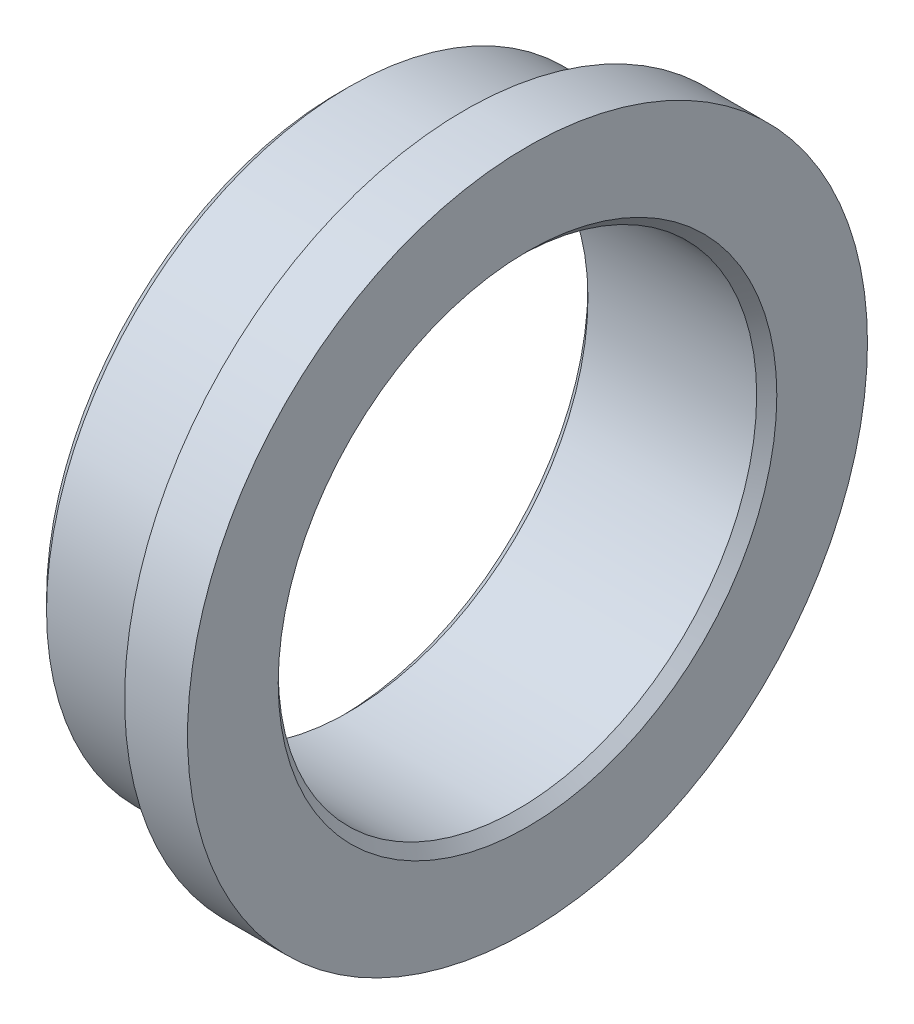
ISO-10303-21;
HEADER;
FILE_DESCRIPTION(('STEP AP214'),'2;1');
FILE_NAME('part.step','',(''),(''),'','','');
FILE_SCHEMA(('AUTOMOTIVE_DESIGN { 1 0 10303 214 1 1 1 1 }'));
ENDSEC;
DATA;
#1=APPLICATION_CONTEXT('core data for automotive mechanical design processes');
#2=APPLICATION_PROTOCOL_DEFINITION('international standard','automotive_design',2000,#1);
#3=PRODUCT_CONTEXT('',#1,'mechanical');
#4=PRODUCT('Part','Part','',(#3));
#5=PRODUCT_RELATED_PRODUCT_CATEGORY('part','',(#4));
#6=PRODUCT_DEFINITION_FORMATION('','',#4);
#7=PRODUCT_DEFINITION_CONTEXT('part definition',#1,'design');
#8=PRODUCT_DEFINITION('design','',#6,#7);
#9=PRODUCT_DEFINITION_SHAPE('','',#8);
#10=(LENGTH_UNIT() NAMED_UNIT(*) SI_UNIT(.MILLI.,.METRE.));
#11=(NAMED_UNIT(*) PLANE_ANGLE_UNIT() SI_UNIT($,.RADIAN.));
#12=(NAMED_UNIT(*) SI_UNIT($,.STERADIAN.) SOLID_ANGLE_UNIT());
#13=UNCERTAINTY_MEASURE_WITH_UNIT(LENGTH_MEASURE(1.E-05),#10,'distance_accuracy_value','');
#14=(GEOMETRIC_REPRESENTATION_CONTEXT(3) GLOBAL_UNCERTAINTY_ASSIGNED_CONTEXT((#13)) GLOBAL_UNIT_ASSIGNED_CONTEXT((#10,
#11,#12)) REPRESENTATION_CONTEXT('',''));
#15=CARTESIAN_POINT('',(0.,0.,0.));
#16=DIRECTION('',(0.,0.,1.));
#17=DIRECTION('',(1.,0.,0.));
#18=AXIS2_PLACEMENT_3D('',#15,#16,#17);
#19=CARTESIAN_POINT('',(0.,25.3690789507421,0.));
#20=DIRECTION('',(-1.,0.,0.));
#21=DIRECTION('',(0.,0.,1.));
#22=AXIS2_PLACEMENT_3D('',#19,#20,#21);
#23=PLANE('',#22);
#24=CARTESIAN_POINT('',(0.,0.,0.));
#25=DIRECTION('',(1.,0.,0.));
#26=DIRECTION('',(0.,0.,-1.));
#27=AXIS2_PLACEMENT_3D('',#24,#25,#26);
#28=CIRCLE('',#27,23.8);
#29=CARTESIAN_POINT('',(0.,0.,-23.8));
#30=VERTEX_POINT('',#29);
#31=EDGE_CURVE('E75',#30,#30,#28,.T.);
#32=ORIENTED_EDGE('',*,*,#31,.T.);
#33=EDGE_LOOP('',(#32));
#34=FACE_BOUND('',#33,.T.);
#35=CARTESIAN_POINT('',(0.,0.,0.));
#36=DIRECTION('',(1.,0.,0.));
#37=DIRECTION('',(0.,0.,-1.));
#38=AXIS2_PLACEMENT_3D('',#35,#36,#37);
#39=CIRCLE('',#38,27.);
#40=CARTESIAN_POINT('',(0.,0.,-27.));
#41=VERTEX_POINT('',#40);
#42=EDGE_CURVE('E63',#41,#41,#39,.T.);
#43=ORIENTED_EDGE('',*,*,#42,.F.);
#44=EDGE_LOOP('',(#43));
#45=FACE_BOUND('',#44,.T.);
#46=ADVANCED_FACE('F36',(#34,#45),#23,.T.);
#47=CARTESIAN_POINT('',(6.5,0.,0.));
#48=DIRECTION('',(1.,0.,0.));
#49=DIRECTION('',(0.,0.,-1.));
#50=AXIS2_PLACEMENT_3D('',#47,#48,#49);
#51=CYLINDRICAL_SURFACE('',#50,27.);
#52=ORIENTED_EDGE('',*,*,#42,.T.);
#53=EDGE_LOOP('',(#52));
#54=FACE_BOUND('',#53,.T.);
#55=CARTESIAN_POINT('',(5.,0.,0.));
#56=DIRECTION('',(1.,0.,0.));
#57=DIRECTION('',(0.,0.,-1.));
#58=AXIS2_PLACEMENT_3D('',#55,#56,#57);
#59=CIRCLE('',#58,27.);
#60=CARTESIAN_POINT('',(5.,0.,-27.));
#61=VERTEX_POINT('',#60);
#62=EDGE_CURVE('E66',#61,#61,#59,.T.);
#63=ORIENTED_EDGE('',*,*,#62,.F.);
#64=EDGE_LOOP('',(#63));
#65=FACE_BOUND('',#64,.T.);
#66=ADVANCED_FACE('F98',(#54,#65),#51,.T.);
#67=CARTESIAN_POINT('',(5.,27.,0.));
#68=DIRECTION('',(1.,0.,0.));
#69=DIRECTION('',(0.,0.,-1.));
#70=AXIS2_PLACEMENT_3D('',#67,#68,#69);
#71=PLANE('',#70);
#72=CARTESIAN_POINT('',(5.,0.,0.));
#73=DIRECTION('',(1.,0.,0.));
#74=DIRECTION('',(0.,0.,-1.));
#75=AXIS2_PLACEMENT_3D('',#72,#73,#74);
#76=CIRCLE('',#75,19.8);
#77=CARTESIAN_POINT('',(5.,0.,-19.8));
#78=VERTEX_POINT('',#77);
#79=EDGE_CURVE('E52',#78,#78,#76,.F.);
#80=ORIENTED_EDGE('',*,*,#79,.T.);
#81=EDGE_LOOP('',(#80));
#82=FACE_BOUND('',#81,.T.);
#83=ORIENTED_EDGE('',*,*,#62,.T.);
#84=EDGE_LOOP('',(#83));
#85=FACE_BOUND('',#84,.T.);
#86=ADVANCED_FACE('F103',(#82,#85),#71,.T.);
#87=CARTESIAN_POINT('',(6.5,0.,0.));
#88=DIRECTION('',(1.,0.,0.));
#89=DIRECTION('',(0.,0.,-1.));
#90=AXIS2_PLACEMENT_3D('',#87,#88,#89);
#91=CYLINDRICAL_SURFACE('',#90,19.);
#92=CARTESIAN_POINT('',(4.2,0.,0.));
#93=DIRECTION('',(1.,0.,0.));
#94=DIRECTION('',(0.,0.,-1.));
#95=AXIS2_PLACEMENT_3D('',#92,#93,#94);
#96=CIRCLE('',#95,19.);
#97=CARTESIAN_POINT('',(4.2,0.,-19.));
#98=VERTEX_POINT('',#97);
#99=EDGE_CURVE('E57',#98,#98,#96,.T.);
#100=ORIENTED_EDGE('',*,*,#99,.T.);
#101=EDGE_LOOP('',(#100));
#102=FACE_BOUND('',#101,.T.);
#103=CARTESIAN_POINT('',(-9.19999999999999,0.,0.));
#104=DIRECTION('',(-1.,0.,0.));
#105=DIRECTION('',(0.,0.,1.));
#106=AXIS2_PLACEMENT_3D('',#103,#104,#105);
#107=CIRCLE('',#106,19.);
#108=CARTESIAN_POINT('',(-9.19999999999999,0.,19.));
#109=VERTEX_POINT('',#108);
#110=EDGE_CURVE('E60',#109,#109,#107,.T.);
#111=ORIENTED_EDGE('',*,*,#110,.T.);
#112=EDGE_LOOP('',(#111));
#113=FACE_BOUND('',#112,.T.);
#114=ADVANCED_FACE('F132',(#102,#113),#91,.F.);
#115=CARTESIAN_POINT('',(-10.,19.,0.));
#116=DIRECTION('',(-1.,0.,0.));
#117=DIRECTION('',(0.,0.,1.));
#118=AXIS2_PLACEMENT_3D('',#115,#116,#117);
#119=PLANE('',#118);
#120=CARTESIAN_POINT('',(-10.,0.,0.));
#121=DIRECTION('',(-1.,0.,0.));
#122=DIRECTION('',(0.,0.,1.));
#123=AXIS2_PLACEMENT_3D('',#120,#121,#122);
#124=CIRCLE('',#123,23.2);
#125=CARTESIAN_POINT('',(-10.,0.,23.2));
#126=VERTEX_POINT('',#125);
#127=EDGE_CURVE('E10',#126,#126,#124,.T.);
#128=ORIENTED_EDGE('',*,*,#127,.T.);
#129=EDGE_LOOP('',(#128));
#130=FACE_BOUND('',#129,.T.);
#131=CARTESIAN_POINT('',(-10.,0.,0.));
#132=DIRECTION('',(-1.,0.,0.));
#133=DIRECTION('',(0.,0.,1.));
#134=AXIS2_PLACEMENT_3D('',#131,#132,#133);
#135=CIRCLE('',#134,19.8);
#136=CARTESIAN_POINT('',(-10.,0.,19.8));
#137=VERTEX_POINT('',#136);
#138=EDGE_CURVE('E44',#137,#137,#135,.F.);
#139=ORIENTED_EDGE('',*,*,#138,.T.);
#140=EDGE_LOOP('',(#139));
#141=FACE_BOUND('',#140,.T.);
#142=ADVANCED_FACE('F124',(#130,#141),#119,.T.);
#143=CARTESIAN_POINT('',(6.5,0.,0.));
#144=DIRECTION('',(1.,0.,0.));
#145=DIRECTION('',(0.,0.,-1.));
#146=AXIS2_PLACEMENT_3D('',#143,#144,#145);
#147=CYLINDRICAL_SURFACE('',#146,24.);
#148=CARTESIAN_POINT('',(-9.20000000000001,0.,0.));
#149=DIRECTION('',(-1.,0.,0.));
#150=DIRECTION('',(0.,0.,1.));
#151=AXIS2_PLACEMENT_3D('',#148,#149,#150);
#152=CIRCLE('',#151,24.);
#153=CARTESIAN_POINT('',(-9.20000000000001,0.,24.));
#154=VERTEX_POINT('',#153);
#155=EDGE_CURVE('E48',#154,#154,#152,.F.);
#156=ORIENTED_EDGE('',*,*,#155,.T.);
#157=EDGE_LOOP('',(#156));
#158=FACE_BOUND('',#157,.T.);
#159=CARTESIAN_POINT('',(-2.,0.,0.));
#160=DIRECTION('',(1.,0.,0.));
#161=DIRECTION('',(0.,0.,-1.));
#162=AXIS2_PLACEMENT_3D('',#159,#160,#161);
#163=CIRCLE('',#162,24.);
#164=CARTESIAN_POINT('',(-2.,0.,-24.));
#165=VERTEX_POINT('',#164);
#166=EDGE_CURVE('E69',#165,#165,#163,.T.);
#167=ORIENTED_EDGE('',*,*,#166,.F.);
#168=EDGE_LOOP('',(#167));
#169=FACE_BOUND('',#168,.T.);
#170=ADVANCED_FACE('F94',(#158,#169),#147,.T.);
#171=CARTESIAN_POINT('',(-2.,23.8,0.));
#172=DIRECTION('',(1.,0.,0.));
#173=DIRECTION('',(0.,0.,-1.));
#174=AXIS2_PLACEMENT_3D('',#171,#172,#173);
#175=PLANE('',#174);
#176=ORIENTED_EDGE('',*,*,#166,.T.);
#177=EDGE_LOOP('',(#176));
#178=FACE_BOUND('',#177,.T.);
#179=CARTESIAN_POINT('',(-2.,0.,0.));
#180=DIRECTION('',(1.,0.,0.));
#181=DIRECTION('',(0.,0.,-1.));
#182=AXIS2_PLACEMENT_3D('',#179,#180,#181);
#183=CIRCLE('',#182,23.8);
#184=CARTESIAN_POINT('',(-2.,0.,-23.8));
#185=VERTEX_POINT('',#184);
#186=EDGE_CURVE('E72',#185,#185,#183,.T.);
#187=ORIENTED_EDGE('',*,*,#186,.F.);
#188=EDGE_LOOP('',(#187));
#189=FACE_BOUND('',#188,.T.);
#190=ADVANCED_FACE('F84',(#178,#189),#175,.T.);
#191=CARTESIAN_POINT('',(6.5,0.,0.));
#192=DIRECTION('',(1.,0.,0.));
#193=DIRECTION('',(0.,0.,-1.));
#194=AXIS2_PLACEMENT_3D('',#191,#192,#193);
#195=CYLINDRICAL_SURFACE('',#194,23.8);
#196=ORIENTED_EDGE('',*,*,#186,.T.);
#197=EDGE_LOOP('',(#196));
#198=FACE_BOUND('',#197,.T.);
#199=ORIENTED_EDGE('',*,*,#31,.F.);
#200=EDGE_LOOP('',(#199));
#201=FACE_BOUND('',#200,.T.);
#202=ADVANCED_FACE('F81',(#198,#201),#195,.T.);
#203=CARTESIAN_POINT('',(4.2,0.,0.));
#204=DIRECTION('',(1.,0.,0.));
#205=DIRECTION('',(0.,0.,-1.));
#206=AXIS2_PLACEMENT_3D('',#203,#204,#205);
#207=CONICAL_SURFACE('',#206,19.,0.78539816339745);
#208=ORIENTED_EDGE('',*,*,#79,.F.);
#209=EDGE_LOOP('',(#208));
#210=FACE_BOUND('',#209,.T.);
#211=ORIENTED_EDGE('',*,*,#99,.F.);
#212=EDGE_LOOP('',(#211));
#213=FACE_BOUND('',#212,.T.);
#214=ADVANCED_FACE('F83',(#210,#213),#207,.F.);
#215=CARTESIAN_POINT('',(-9.20000000000001,0.,0.));
#216=DIRECTION('',(1.,0.,0.));
#217=DIRECTION('',(0.,0.,-1.));
#218=AXIS2_PLACEMENT_3D('',#215,#216,#217);
#219=CONICAL_SURFACE('',#218,24.,0.785398163397446);
#220=ORIENTED_EDGE('',*,*,#127,.F.);
#221=EDGE_LOOP('',(#220));
#222=FACE_BOUND('',#221,.T.);
#223=ORIENTED_EDGE('',*,*,#155,.F.);
#224=EDGE_LOOP('',(#223));
#225=FACE_BOUND('',#224,.T.);
#226=ADVANCED_FACE('F91',(#222,#225),#219,.T.);
#227=CARTESIAN_POINT('',(-10.,0.,0.));
#228=DIRECTION('',(-1.,0.,0.));
#229=DIRECTION('',(0.,0.,1.));
#230=AXIS2_PLACEMENT_3D('',#227,#228,#229);
#231=CONICAL_SURFACE('',#230,19.8,0.785398163397446);
#232=ORIENTED_EDGE('',*,*,#110,.F.);
#233=EDGE_LOOP('',(#232));
#234=FACE_BOUND('',#233,.T.);
#235=ORIENTED_EDGE('',*,*,#138,.F.);
#236=EDGE_LOOP('',(#235));
#237=FACE_BOUND('',#236,.T.);
#238=ADVANCED_FACE('F39',(#234,#237),#231,.F.);
#239=CLOSED_SHELL('',(#46,#66,#86,#114,#142,#170,#190,#202,#214,#226,#238));
#240=MANIFOLD_SOLID_BREP('B2',#239);
#241=ADVANCED_BREP_SHAPE_REPRESENTATION('',(#18,#240),#14);
#242=SHAPE_DEFINITION_REPRESENTATION(#9,#241);
ENDSEC;
END-ISO-10303-21;
